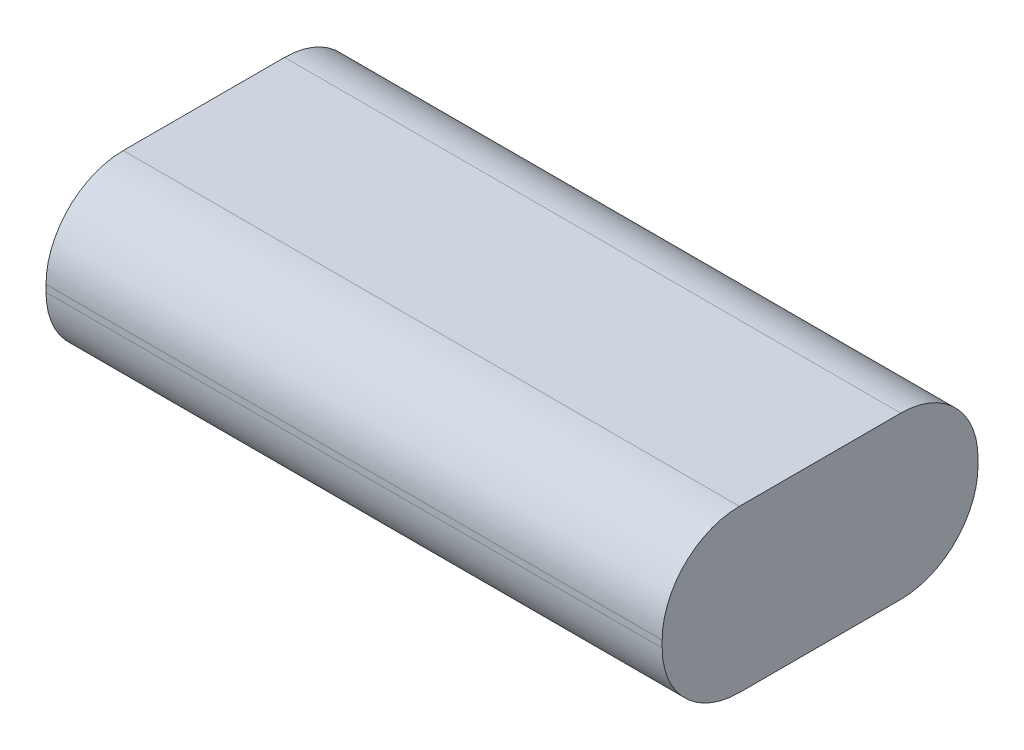
ISO-10303-21;
HEADER;
FILE_DESCRIPTION(('STEP AP214'),'2;1');
FILE_NAME('part.step','',(''),(''),'','','');
FILE_SCHEMA(('AUTOMOTIVE_DESIGN { 1 0 10303 214 1 1 1 1 }'));
ENDSEC;
DATA;
#1=APPLICATION_CONTEXT('core data for automotive mechanical design processes');
#2=APPLICATION_PROTOCOL_DEFINITION('international standard','automotive_design',2000,#1);
#3=PRODUCT_CONTEXT('',#1,'mechanical');
#4=PRODUCT('Part','Part','',(#3));
#5=PRODUCT_RELATED_PRODUCT_CATEGORY('part','',(#4));
#6=PRODUCT_DEFINITION_FORMATION('','',#4);
#7=PRODUCT_DEFINITION_CONTEXT('part definition',#1,'design');
#8=PRODUCT_DEFINITION('design','',#6,#7);
#9=PRODUCT_DEFINITION_SHAPE('','',#8);
#10=(LENGTH_UNIT() NAMED_UNIT(*) SI_UNIT(.MILLI.,.METRE.));
#11=(NAMED_UNIT(*) PLANE_ANGLE_UNIT() SI_UNIT($,.RADIAN.));
#12=(NAMED_UNIT(*) SI_UNIT($,.STERADIAN.) SOLID_ANGLE_UNIT());
#13=UNCERTAINTY_MEASURE_WITH_UNIT(LENGTH_MEASURE(1.E-05),#10,'distance_accuracy_value','');
#14=(GEOMETRIC_REPRESENTATION_CONTEXT(3) GLOBAL_UNCERTAINTY_ASSIGNED_CONTEXT((#13)) GLOBAL_UNIT_ASSIGNED_CONTEXT((#10,
#11,#12)) REPRESENTATION_CONTEXT('',''));
#15=CARTESIAN_POINT('',(0.,0.,0.));
#16=DIRECTION('',(0.,0.,1.));
#17=DIRECTION('',(1.,0.,0.));
#18=AXIS2_PLACEMENT_3D('',#15,#16,#17);
#19=CARTESIAN_POINT('',(0.,18.8,0.));
#20=DIRECTION('',(1.,0.,0.));
#21=DIRECTION('',(0.,0.,-1.));
#22=AXIS2_PLACEMENT_3D('',#19,#20,#21);
#23=PLANE('',#22);
#24=DIRECTION('',(0.,0.,1.));
#25=VECTOR('',#24,1.);
#26=CARTESIAN_POINT('',(0.,18.8,0.));
#27=LINE('',#26,#25);
#28=CARTESIAN_POINT('',(0.,18.8,-27.8));
#29=VERTEX_POINT('',#28);
#30=CARTESIAN_POINT('',(0.,18.8,-9.));
#31=VERTEX_POINT('',#30);
#32=EDGE_CURVE('E120',#29,#31,#27,.T.);
#33=ORIENTED_EDGE('',*,*,#32,.F.);
#34=CARTESIAN_POINT('',(0.,9.8,-27.8));
#35=DIRECTION('',(1.,0.,0.));
#36=DIRECTION('',(0.,0.,-1.));
#37=AXIS2_PLACEMENT_3D('',#34,#35,#36);
#38=CIRCLE('',#37,9.);
#39=CARTESIAN_POINT('',(0.,9.8,-36.8));
#40=VERTEX_POINT('',#39);
#41=EDGE_CURVE('E102',#29,#40,#38,.F.);
#42=ORIENTED_EDGE('',*,*,#41,.T.);
#43=DIRECTION('',(0.,-1.,0.));
#44=VECTOR('',#43,1.);
#45=CARTESIAN_POINT('',(0.,18.8,-36.8));
#46=LINE('',#45,#44);
#47=CARTESIAN_POINT('',(0.,9.,-36.8));
#48=VERTEX_POINT('',#47);
#49=EDGE_CURVE('E130',#40,#48,#46,.T.);
#50=ORIENTED_EDGE('',*,*,#49,.T.);
#51=CARTESIAN_POINT('',(0.,9.,-27.8));
#52=DIRECTION('',(1.,0.,0.));
#53=DIRECTION('',(0.,0.,-1.));
#54=AXIS2_PLACEMENT_3D('',#51,#52,#53);
#55=CIRCLE('',#54,9.);
#56=CARTESIAN_POINT('',(0.,0.,-27.8));
#57=VERTEX_POINT('',#56);
#58=EDGE_CURVE('E113',#48,#57,#55,.F.);
#59=ORIENTED_EDGE('',*,*,#58,.T.);
#60=DIRECTION('',(0.,0.,1.));
#61=VECTOR('',#60,1.);
#62=CARTESIAN_POINT('',(0.,0.,0.));
#63=LINE('',#62,#61);
#64=CARTESIAN_POINT('',(0.,0.,-9.));
#65=VERTEX_POINT('',#64);
#66=EDGE_CURVE('E133',#57,#65,#63,.T.);
#67=ORIENTED_EDGE('',*,*,#66,.T.);
#68=CARTESIAN_POINT('',(0.,9.,-9.));
#69=DIRECTION('',(1.,0.,0.));
#70=DIRECTION('',(0.,0.,-1.));
#71=AXIS2_PLACEMENT_3D('',#68,#69,#70);
#72=CIRCLE('',#71,9.);
#73=CARTESIAN_POINT('',(0.,9.,0.));
#74=VERTEX_POINT('',#73);
#75=EDGE_CURVE('E149',#65,#74,#72,.F.);
#76=ORIENTED_EDGE('',*,*,#75,.T.);
#77=DIRECTION('',(0.,-1.,0.));
#78=VECTOR('',#77,1.);
#79=CARTESIAN_POINT('',(0.,18.8,0.));
#80=LINE('',#79,#78);
#81=CARTESIAN_POINT('',(0.,9.8,0.));
#82=VERTEX_POINT('',#81);
#83=EDGE_CURVE('E144',#82,#74,#80,.T.);
#84=ORIENTED_EDGE('',*,*,#83,.F.);
#85=CARTESIAN_POINT('',(0.,9.8,-9.));
#86=DIRECTION('',(1.,0.,0.));
#87=DIRECTION('',(0.,0.,-1.));
#88=AXIS2_PLACEMENT_3D('',#85,#86,#87);
#89=CIRCLE('',#88,9.);
#90=EDGE_CURVE('E123',#82,#31,#89,.F.);
#91=ORIENTED_EDGE('',*,*,#90,.T.);
#92=EDGE_LOOP('',(#33,#42,#50,#59,#67,#76,#84,#91));
#93=FACE_BOUND('',#92,.T.);
#94=ADVANCED_FACE('F36',(#93),#23,.F.);
#95=CARTESIAN_POINT('',(0.,18.8,0.));
#96=DIRECTION('',(0.,0.,-1.));
#97=DIRECTION('',(-1.,0.,0.));
#98=AXIS2_PLACEMENT_3D('',#95,#96,#97);
#99=PLANE('',#98);
#100=ORIENTED_EDGE('',*,*,#83,.T.);
#101=DIRECTION('',(1.,0.,0.));
#102=VECTOR('',#101,1.);
#103=CARTESIAN_POINT('',(71.8,9.,0.));
#104=LINE('',#103,#102);
#105=CARTESIAN_POINT('',(71.8,9.,0.));
#106=VERTEX_POINT('',#105);
#107=EDGE_CURVE('E11',#74,#106,#104,.T.);
#108=ORIENTED_EDGE('',*,*,#107,.T.);
#109=DIRECTION('',(0.,-1.,0.));
#110=VECTOR('',#109,1.);
#111=CARTESIAN_POINT('',(71.8,18.8,0.));
#112=LINE('',#111,#110);
#113=CARTESIAN_POINT('',(71.8,9.8,0.));
#114=VERTEX_POINT('',#113);
#115=EDGE_CURVE('E142',#114,#106,#112,.T.);
#116=ORIENTED_EDGE('',*,*,#115,.F.);
#117=DIRECTION('',(1.,0.,0.));
#118=VECTOR('',#117,1.);
#119=CARTESIAN_POINT('',(0.,9.8,0.));
#120=LINE('',#119,#118);
#121=EDGE_CURVE('E44',#114,#82,#120,.F.);
#122=ORIENTED_EDGE('',*,*,#121,.T.);
#123=EDGE_LOOP('',(#100,#108,#116,#122));
#124=FACE_BOUND('',#123,.T.);
#125=ADVANCED_FACE('F166',(#124),#99,.F.);
#126=CARTESIAN_POINT('',(71.8,18.8,0.));
#127=DIRECTION('',(-1.,0.,0.));
#128=DIRECTION('',(0.,0.,1.));
#129=AXIS2_PLACEMENT_3D('',#126,#127,#128);
#130=PLANE('',#129);
#131=DIRECTION('',(0.,-1.,0.));
#132=VECTOR('',#131,1.);
#133=CARTESIAN_POINT('',(71.8,18.8,-36.8));
#134=LINE('',#133,#132);
#135=CARTESIAN_POINT('',(71.8,9.8,-36.8));
#136=VERTEX_POINT('',#135);
#137=CARTESIAN_POINT('',(71.8,9.,-36.8));
#138=VERTEX_POINT('',#137);
#139=EDGE_CURVE('E139',#136,#138,#134,.T.);
#140=ORIENTED_EDGE('',*,*,#139,.F.);
#141=CARTESIAN_POINT('',(71.8,9.8,-27.8));
#142=DIRECTION('',(-1.,0.,0.));
#143=DIRECTION('',(0.,0.,1.));
#144=AXIS2_PLACEMENT_3D('',#141,#142,#143);
#145=CIRCLE('',#144,9.);
#146=CARTESIAN_POINT('',(71.8,18.8,-27.8));
#147=VERTEX_POINT('',#146);
#148=EDGE_CURVE('E159',#136,#147,#145,.F.);
#149=ORIENTED_EDGE('',*,*,#148,.T.);
#150=DIRECTION('',(0.,0.,-1.));
#151=VECTOR('',#150,1.);
#152=CARTESIAN_POINT('',(71.8,18.8,0.));
#153=LINE('',#152,#151);
#154=CARTESIAN_POINT('',(71.8,18.8,-9.));
#155=VERTEX_POINT('',#154);
#156=EDGE_CURVE('E122',#155,#147,#153,.T.);
#157=ORIENTED_EDGE('',*,*,#156,.F.);
#158=CARTESIAN_POINT('',(71.8,9.8,-9.));
#159=DIRECTION('',(-1.,0.,0.));
#160=DIRECTION('',(0.,0.,1.));
#161=AXIS2_PLACEMENT_3D('',#158,#159,#160);
#162=CIRCLE('',#161,9.);
#163=EDGE_CURVE('E58',#155,#114,#162,.F.);
#164=ORIENTED_EDGE('',*,*,#163,.T.);
#165=ORIENTED_EDGE('',*,*,#115,.T.);
#166=CARTESIAN_POINT('',(71.8,9.,-9.));
#167=DIRECTION('',(-1.,0.,0.));
#168=DIRECTION('',(0.,0.,1.));
#169=AXIS2_PLACEMENT_3D('',#166,#167,#168);
#170=CIRCLE('',#169,9.);
#171=CARTESIAN_POINT('',(71.8,0.,-9.));
#172=VERTEX_POINT('',#171);
#173=EDGE_CURVE('E51',#106,#172,#170,.F.);
#174=ORIENTED_EDGE('',*,*,#173,.T.);
#175=DIRECTION('',(0.,0.,-1.));
#176=VECTOR('',#175,1.);
#177=CARTESIAN_POINT('',(71.8,0.,0.));
#178=LINE('',#177,#176);
#179=CARTESIAN_POINT('',(71.8,0.,-27.8));
#180=VERTEX_POINT('',#179);
#181=EDGE_CURVE('E128',#172,#180,#178,.T.);
#182=ORIENTED_EDGE('',*,*,#181,.T.);
#183=CARTESIAN_POINT('',(71.8,9.,-27.8));
#184=DIRECTION('',(-1.,0.,0.));
#185=DIRECTION('',(0.,0.,1.));
#186=AXIS2_PLACEMENT_3D('',#183,#184,#185);
#187=CIRCLE('',#186,9.);
#188=EDGE_CURVE('E157',#180,#138,#187,.F.);
#189=ORIENTED_EDGE('',*,*,#188,.T.);
#190=EDGE_LOOP('',(#140,#149,#157,#164,#165,#174,#182,#189));
#191=FACE_BOUND('',#190,.T.);
#192=ADVANCED_FACE('F170',(#191),#130,.F.);
#193=CARTESIAN_POINT('',(0.,18.8,-36.8));
#194=DIRECTION('',(0.,0.,1.));
#195=DIRECTION('',(1.,0.,0.));
#196=AXIS2_PLACEMENT_3D('',#193,#194,#195);
#197=PLANE('',#196);
#198=ORIENTED_EDGE('',*,*,#49,.F.);
#199=DIRECTION('',(-1.,0.,0.));
#200=VECTOR('',#199,1.);
#201=CARTESIAN_POINT('',(0.,9.8,-36.8));
#202=LINE('',#201,#200);
#203=EDGE_CURVE('E107',#40,#136,#202,.F.);
#204=ORIENTED_EDGE('',*,*,#203,.T.);
#205=ORIENTED_EDGE('',*,*,#139,.T.);
#206=DIRECTION('',(-1.,0.,0.));
#207=VECTOR('',#206,1.);
#208=CARTESIAN_POINT('',(0.,9.,-36.8));
#209=LINE('',#208,#207);
#210=EDGE_CURVE('E112',#138,#48,#209,.T.);
#211=ORIENTED_EDGE('',*,*,#210,.T.);
#212=EDGE_LOOP('',(#198,#204,#205,#211));
#213=FACE_BOUND('',#212,.T.);
#214=ADVANCED_FACE('F174',(#213),#197,.F.);
#215=CARTESIAN_POINT('',(0.,18.8,0.));
#216=DIRECTION('',(0.,-1.,0.));
#217=DIRECTION('',(0.,0.,-1.));
#218=AXIS2_PLACEMENT_3D('',#215,#216,#217);
#219=PLANE('',#218);
#220=ORIENTED_EDGE('',*,*,#156,.T.);
#221=DIRECTION('',(-1.,0.,0.));
#222=VECTOR('',#221,1.);
#223=CARTESIAN_POINT('',(0.,18.8,-27.8));
#224=LINE('',#223,#222);
#225=EDGE_CURVE('E106',#147,#29,#224,.T.);
#226=ORIENTED_EDGE('',*,*,#225,.T.);
#227=ORIENTED_EDGE('',*,*,#32,.T.);
#228=DIRECTION('',(1.,0.,0.));
#229=VECTOR('',#228,1.);
#230=CARTESIAN_POINT('',(0.,18.8,-9.));
#231=LINE('',#230,#229);
#232=EDGE_CURVE('E124',#31,#155,#231,.T.);
#233=ORIENTED_EDGE('',*,*,#232,.T.);
#234=EDGE_LOOP('',(#220,#226,#227,#233));
#235=FACE_BOUND('',#234,.T.);
#236=ADVANCED_FACE('F118',(#235),#219,.F.);
#237=CARTESIAN_POINT('',(0.,0.,0.));
#238=DIRECTION('',(0.,-1.,0.));
#239=DIRECTION('',(0.,0.,-1.));
#240=AXIS2_PLACEMENT_3D('',#237,#238,#239);
#241=PLANE('',#240);
#242=ORIENTED_EDGE('',*,*,#66,.F.);
#243=DIRECTION('',(-1.,0.,0.));
#244=VECTOR('',#243,1.);
#245=CARTESIAN_POINT('',(71.8,0.,-27.8));
#246=LINE('',#245,#244);
#247=EDGE_CURVE('E163',#57,#180,#246,.F.);
#248=ORIENTED_EDGE('',*,*,#247,.T.);
#249=ORIENTED_EDGE('',*,*,#181,.F.);
#250=DIRECTION('',(1.,0.,0.));
#251=VECTOR('',#250,1.);
#252=CARTESIAN_POINT('',(0.,0.,-9.));
#253=LINE('',#252,#251);
#254=EDGE_CURVE('E161',#172,#65,#253,.F.);
#255=ORIENTED_EDGE('',*,*,#254,.T.);
#256=EDGE_LOOP('',(#242,#248,#249,#255));
#257=FACE_BOUND('',#256,.T.);
#258=ADVANCED_FACE('F180',(#257),#241,.T.);
#259=CARTESIAN_POINT('',(0.,9.8,-27.8));
#260=DIRECTION('',(-1.,0.,0.));
#261=DIRECTION('',(0.,0.,1.));
#262=AXIS2_PLACEMENT_3D('',#259,#260,#261);
#263=CYLINDRICAL_SURFACE('',#262,9.);
#264=ORIENTED_EDGE('',*,*,#148,.F.);
#265=ORIENTED_EDGE('',*,*,#203,.F.);
#266=ORIENTED_EDGE('',*,*,#41,.F.);
#267=ORIENTED_EDGE('',*,*,#225,.F.);
#268=EDGE_LOOP('',(#264,#265,#266,#267));
#269=FACE_BOUND('',#268,.T.);
#270=ADVANCED_FACE('F105',(#269),#263,.T.);
#271=CARTESIAN_POINT('',(0.,9.,-27.8));
#272=DIRECTION('',(1.,0.,0.));
#273=DIRECTION('',(0.,0.,-1.));
#274=AXIS2_PLACEMENT_3D('',#271,#272,#273);
#275=CYLINDRICAL_SURFACE('',#274,9.);
#276=ORIENTED_EDGE('',*,*,#188,.F.);
#277=ORIENTED_EDGE('',*,*,#247,.F.);
#278=ORIENTED_EDGE('',*,*,#58,.F.);
#279=ORIENTED_EDGE('',*,*,#210,.F.);
#280=EDGE_LOOP('',(#276,#277,#278,#279));
#281=FACE_BOUND('',#280,.T.);
#282=ADVANCED_FACE('F176',(#281),#275,.T.);
#283=CARTESIAN_POINT('',(0.,9.,-9.));
#284=DIRECTION('',(-1.,0.,0.));
#285=DIRECTION('',(0.,0.,1.));
#286=AXIS2_PLACEMENT_3D('',#283,#284,#285);
#287=CYLINDRICAL_SURFACE('',#286,9.);
#288=ORIENTED_EDGE('',*,*,#75,.F.);
#289=ORIENTED_EDGE('',*,*,#254,.F.);
#290=ORIENTED_EDGE('',*,*,#173,.F.);
#291=ORIENTED_EDGE('',*,*,#107,.F.);
#292=EDGE_LOOP('',(#288,#289,#290,#291));
#293=FACE_BOUND('',#292,.T.);
#294=ADVANCED_FACE('F182',(#293),#287,.T.);
#295=CARTESIAN_POINT('',(0.,9.8,-9.));
#296=DIRECTION('',(1.,0.,0.));
#297=DIRECTION('',(0.,0.,-1.));
#298=AXIS2_PLACEMENT_3D('',#295,#296,#297);
#299=CYLINDRICAL_SURFACE('',#298,9.);
#300=ORIENTED_EDGE('',*,*,#90,.F.);
#301=ORIENTED_EDGE('',*,*,#121,.F.);
#302=ORIENTED_EDGE('',*,*,#163,.F.);
#303=ORIENTED_EDGE('',*,*,#232,.F.);
#304=EDGE_LOOP('',(#300,#301,#302,#303));
#305=FACE_BOUND('',#304,.T.);
#306=ADVANCED_FACE('F38',(#305),#299,.T.);
#307=CLOSED_SHELL('',(#94,#125,#192,#214,#236,#258,#270,#282,#294,#306));
#308=MANIFOLD_SOLID_BREP('B2',#307);
#309=ADVANCED_BREP_SHAPE_REPRESENTATION('',(#18,#308),#14);
#310=SHAPE_DEFINITION_REPRESENTATION(#9,#309);
ENDSEC;
END-ISO-10303-21;
